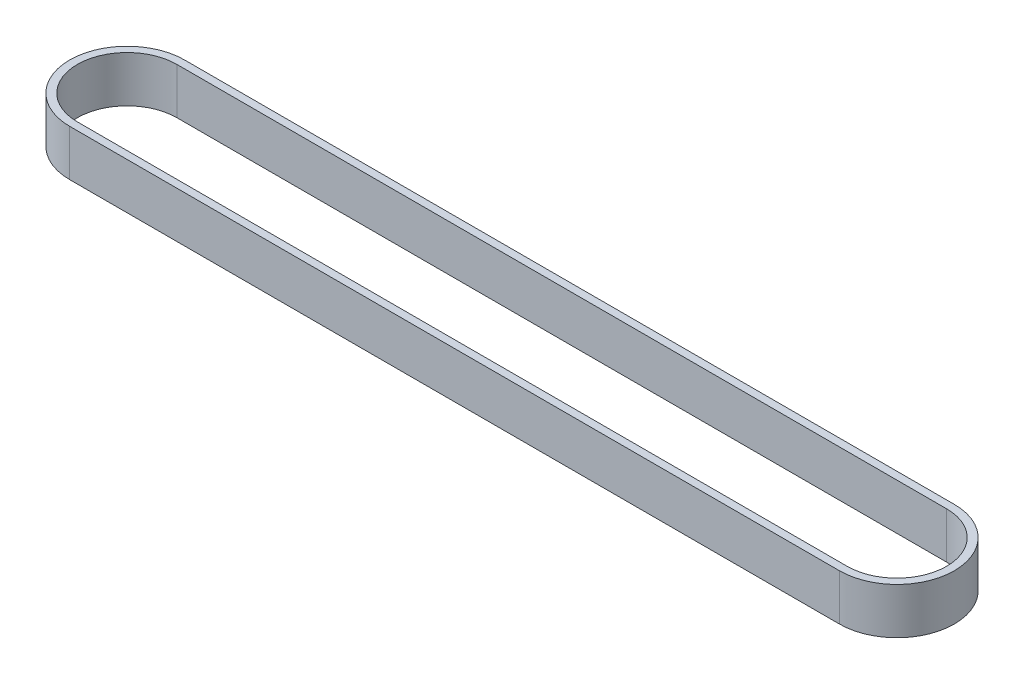
ISO-10303-21;
HEADER;
FILE_DESCRIPTION(('STEP AP214'),'2;1');
FILE_NAME('part.step','',(''),(''),'','','');
FILE_SCHEMA(('AUTOMOTIVE_DESIGN { 1 0 10303 214 1 1 1 1 }'));
ENDSEC;
DATA;
#1=APPLICATION_CONTEXT('core data for automotive mechanical design processes');
#2=APPLICATION_PROTOCOL_DEFINITION('international standard','automotive_design',2000,#1);
#3=PRODUCT_CONTEXT('',#1,'mechanical');
#4=PRODUCT('Part','Part','',(#3));
#5=PRODUCT_RELATED_PRODUCT_CATEGORY('part','',(#4));
#6=PRODUCT_DEFINITION_FORMATION('','',#4);
#7=PRODUCT_DEFINITION_CONTEXT('part definition',#1,'design');
#8=PRODUCT_DEFINITION('design','',#6,#7);
#9=PRODUCT_DEFINITION_SHAPE('','',#8);
#10=(LENGTH_UNIT() NAMED_UNIT(*) SI_UNIT(.MILLI.,.METRE.));
#11=(NAMED_UNIT(*) PLANE_ANGLE_UNIT() SI_UNIT($,.RADIAN.));
#12=(NAMED_UNIT(*) SI_UNIT($,.STERADIAN.) SOLID_ANGLE_UNIT());
#13=UNCERTAINTY_MEASURE_WITH_UNIT(LENGTH_MEASURE(1.E-05),#10,'distance_accuracy_value','');
#14=(GEOMETRIC_REPRESENTATION_CONTEXT(3) GLOBAL_UNCERTAINTY_ASSIGNED_CONTEXT((#13)) GLOBAL_UNIT_ASSIGNED_CONTEXT((#10,
#11,#12)) REPRESENTATION_CONTEXT('',''));
#15=CARTESIAN_POINT('',(0.,0.,0.));
#16=DIRECTION('',(0.,0.,1.));
#17=DIRECTION('',(1.,0.,0.));
#18=AXIS2_PLACEMENT_3D('',#15,#16,#17);
#19=CARTESIAN_POINT('',(-50.,6.,0.));
#20=DIRECTION('',(0.,1.,0.));
#21=DIRECTION('',(0.,0.,1.));
#22=AXIS2_PLACEMENT_3D('',#19,#20,#21);
#23=PLANE('',#22);
#24=CARTESIAN_POINT('',(-50.,6.,0.));
#25=DIRECTION('',(0.,1.,0.));
#26=DIRECTION('',(0.,0.,1.));
#27=AXIS2_PLACEMENT_3D('',#24,#25,#26);
#28=CIRCLE('',#27,7.465);
#29=CARTESIAN_POINT('',(-50.,6.,-7.465));
#30=VERTEX_POINT('',#29);
#31=CARTESIAN_POINT('',(-50.,6.,7.465));
#32=VERTEX_POINT('',#31);
#33=EDGE_CURVE('E134',#30,#32,#28,.T.);
#34=ORIENTED_EDGE('',*,*,#33,.T.);
#35=DIRECTION('',(1.,0.,0.));
#36=VECTOR('',#35,1.);
#37=CARTESIAN_POINT('',(-50.,6.,7.465));
#38=LINE('',#37,#36);
#39=CARTESIAN_POINT('',(50.,6.,7.465));
#40=VERTEX_POINT('',#39);
#41=EDGE_CURVE('E137',#32,#40,#38,.T.);
#42=ORIENTED_EDGE('',*,*,#41,.T.);
#43=CARTESIAN_POINT('',(50.,6.,0.));
#44=DIRECTION('',(0.,1.,0.));
#45=DIRECTION('',(0.,0.,1.));
#46=AXIS2_PLACEMENT_3D('',#43,#44,#45);
#47=CIRCLE('',#46,7.465);
#48=CARTESIAN_POINT('',(50.,6.,-7.465));
#49=VERTEX_POINT('',#48);
#50=EDGE_CURVE('E140',#40,#49,#47,.T.);
#51=ORIENTED_EDGE('',*,*,#50,.T.);
#52=DIRECTION('',(-1.,0.,0.));
#53=VECTOR('',#52,1.);
#54=CARTESIAN_POINT('',(-50.,6.,-7.465));
#55=LINE('',#54,#53);
#56=EDGE_CURVE('E142',#49,#30,#55,.T.);
#57=ORIENTED_EDGE('',*,*,#56,.T.);
#58=EDGE_LOOP('',(#34,#42,#51,#57));
#59=FACE_BOUND('',#58,.T.);
#60=DIRECTION('',(-1.,0.,0.));
#61=VECTOR('',#60,1.);
#62=CARTESIAN_POINT('',(-50.,6.,-6.465));
#63=LINE('',#62,#61);
#64=CARTESIAN_POINT('',(50.,6.,-6.465));
#65=VERTEX_POINT('',#64);
#66=CARTESIAN_POINT('',(-50.,6.,-6.465));
#67=VERTEX_POINT('',#66);
#68=EDGE_CURVE('E106',#65,#67,#63,.T.);
#69=ORIENTED_EDGE('',*,*,#68,.F.);
#70=CARTESIAN_POINT('',(50.,6.,0.));
#71=DIRECTION('',(0.,1.,0.));
#72=DIRECTION('',(0.,0.,1.));
#73=AXIS2_PLACEMENT_3D('',#70,#71,#72);
#74=CIRCLE('',#73,6.465);
#75=CARTESIAN_POINT('',(50.,6.,6.465));
#76=VERTEX_POINT('',#75);
#77=EDGE_CURVE('E98',#76,#65,#74,.T.);
#78=ORIENTED_EDGE('',*,*,#77,.F.);
#79=DIRECTION('',(1.,0.,0.));
#80=VECTOR('',#79,1.);
#81=CARTESIAN_POINT('',(-50.,6.,6.465));
#82=LINE('',#81,#80);
#83=CARTESIAN_POINT('',(-50.,6.,6.465));
#84=VERTEX_POINT('',#83);
#85=EDGE_CURVE('E120',#84,#76,#82,.T.);
#86=ORIENTED_EDGE('',*,*,#85,.F.);
#87=CARTESIAN_POINT('',(-50.,6.,0.));
#88=DIRECTION('',(0.,1.,0.));
#89=DIRECTION('',(0.,0.,1.));
#90=AXIS2_PLACEMENT_3D('',#87,#88,#89);
#91=CIRCLE('',#90,6.465);
#92=EDGE_CURVE('E118',#67,#84,#91,.T.);
#93=ORIENTED_EDGE('',*,*,#92,.F.);
#94=EDGE_LOOP('',(#69,#78,#86,#93));
#95=FACE_BOUND('',#94,.T.);
#96=ADVANCED_FACE('F33',(#59,#95),#23,.T.);
#97=CARTESIAN_POINT('',(-50.,0.,0.));
#98=DIRECTION('',(0.,1.,0.));
#99=DIRECTION('',(0.,0.,1.));
#100=AXIS2_PLACEMENT_3D('',#97,#98,#99);
#101=PLANE('',#100);
#102=CARTESIAN_POINT('',(-50.,0.,0.));
#103=DIRECTION('',(0.,1.,0.));
#104=DIRECTION('',(0.,0.,1.));
#105=AXIS2_PLACEMENT_3D('',#102,#103,#104);
#106=CIRCLE('',#105,7.465);
#107=CARTESIAN_POINT('',(-50.,0.,-7.465));
#108=VERTEX_POINT('',#107);
#109=CARTESIAN_POINT('',(-50.,0.,7.465));
#110=VERTEX_POINT('',#109);
#111=EDGE_CURVE('E114',#108,#110,#106,.T.);
#112=ORIENTED_EDGE('',*,*,#111,.F.);
#113=DIRECTION('',(-1.,0.,0.));
#114=VECTOR('',#113,1.);
#115=CARTESIAN_POINT('',(-50.,0.,-7.465));
#116=LINE('',#115,#114);
#117=CARTESIAN_POINT('',(50.,0.,-7.465));
#118=VERTEX_POINT('',#117);
#119=EDGE_CURVE('E138',#118,#108,#116,.T.);
#120=ORIENTED_EDGE('',*,*,#119,.F.);
#121=CARTESIAN_POINT('',(50.,0.,0.));
#122=DIRECTION('',(0.,1.,0.));
#123=DIRECTION('',(0.,0.,1.));
#124=AXIS2_PLACEMENT_3D('',#121,#122,#123);
#125=CIRCLE('',#124,7.465);
#126=CARTESIAN_POINT('',(50.,0.,7.465));
#127=VERTEX_POINT('',#126);
#128=EDGE_CURVE('E149',#127,#118,#125,.T.);
#129=ORIENTED_EDGE('',*,*,#128,.F.);
#130=DIRECTION('',(1.,0.,0.));
#131=VECTOR('',#130,1.);
#132=CARTESIAN_POINT('',(-50.,0.,7.465));
#133=LINE('',#132,#131);
#134=EDGE_CURVE('E147',#110,#127,#133,.T.);
#135=ORIENTED_EDGE('',*,*,#134,.F.);
#136=EDGE_LOOP('',(#112,#120,#129,#135));
#137=FACE_BOUND('',#136,.T.);
#138=CARTESIAN_POINT('',(50.,0.,0.));
#139=DIRECTION('',(0.,1.,0.));
#140=DIRECTION('',(0.,0.,1.));
#141=AXIS2_PLACEMENT_3D('',#138,#139,#140);
#142=CIRCLE('',#141,6.465);
#143=CARTESIAN_POINT('',(50.,0.,6.465));
#144=VERTEX_POINT('',#143);
#145=CARTESIAN_POINT('',(50.,0.,-6.465));
#146=VERTEX_POINT('',#145);
#147=EDGE_CURVE('E56',#144,#146,#142,.T.);
#148=ORIENTED_EDGE('',*,*,#147,.T.);
#149=DIRECTION('',(-1.,0.,0.));
#150=VECTOR('',#149,1.);
#151=CARTESIAN_POINT('',(-50.,0.,-6.465));
#152=LINE('',#151,#150);
#153=CARTESIAN_POINT('',(-50.,0.,-6.465));
#154=VERTEX_POINT('',#153);
#155=EDGE_CURVE('E113',#146,#154,#152,.T.);
#156=ORIENTED_EDGE('',*,*,#155,.T.);
#157=CARTESIAN_POINT('',(-50.,0.,0.));
#158=DIRECTION('',(0.,1.,0.));
#159=DIRECTION('',(0.,0.,1.));
#160=AXIS2_PLACEMENT_3D('',#157,#158,#159);
#161=CIRCLE('',#160,6.465);
#162=CARTESIAN_POINT('',(-50.,0.,6.465));
#163=VERTEX_POINT('',#162);
#164=EDGE_CURVE('E126',#154,#163,#161,.T.);
#165=ORIENTED_EDGE('',*,*,#164,.T.);
#166=DIRECTION('',(1.,0.,0.));
#167=VECTOR('',#166,1.);
#168=CARTESIAN_POINT('',(-50.,0.,6.465));
#169=LINE('',#168,#167);
#170=EDGE_CURVE('E107',#163,#144,#169,.T.);
#171=ORIENTED_EDGE('',*,*,#170,.T.);
#172=EDGE_LOOP('',(#148,#156,#165,#171));
#173=FACE_BOUND('',#172,.T.);
#174=ADVANCED_FACE('F167',(#137,#173),#101,.F.);
#175=CARTESIAN_POINT('',(-50.,6.,0.));
#176=DIRECTION('',(0.,-1.,0.));
#177=DIRECTION('',(0.,0.,-1.));
#178=AXIS2_PLACEMENT_3D('',#175,#176,#177);
#179=CYLINDRICAL_SURFACE('',#178,7.465);
#180=ORIENTED_EDGE('',*,*,#111,.T.);
#181=DIRECTION('',(0.,-1.,0.));
#182=VECTOR('',#181,1.);
#183=CARTESIAN_POINT('',(-50.,6.,7.465));
#184=LINE('',#183,#182);
#185=EDGE_CURVE('E11',#32,#110,#184,.T.);
#186=ORIENTED_EDGE('',*,*,#185,.F.);
#187=ORIENTED_EDGE('',*,*,#33,.F.);
#188=DIRECTION('',(0.,-1.,0.));
#189=VECTOR('',#188,1.);
#190=CARTESIAN_POINT('',(-50.,6.,-7.465));
#191=LINE('',#190,#189);
#192=EDGE_CURVE('E144',#30,#108,#191,.T.);
#193=ORIENTED_EDGE('',*,*,#192,.T.);
#194=EDGE_LOOP('',(#180,#186,#187,#193));
#195=FACE_BOUND('',#194,.T.);
#196=ADVANCED_FACE('F35',(#195),#179,.T.);
#197=CARTESIAN_POINT('',(-50.,6.,7.465));
#198=DIRECTION('',(0.,0.,-1.));
#199=DIRECTION('',(-1.,0.,0.));
#200=AXIS2_PLACEMENT_3D('',#197,#198,#199);
#201=PLANE('',#200);
#202=ORIENTED_EDGE('',*,*,#134,.T.);
#203=DIRECTION('',(0.,-1.,0.));
#204=VECTOR('',#203,1.);
#205=CARTESIAN_POINT('',(50.,6.,7.465));
#206=LINE('',#205,#204);
#207=EDGE_CURVE('E41',#40,#127,#206,.T.);
#208=ORIENTED_EDGE('',*,*,#207,.F.);
#209=ORIENTED_EDGE('',*,*,#41,.F.);
#210=ORIENTED_EDGE('',*,*,#185,.T.);
#211=EDGE_LOOP('',(#202,#208,#209,#210));
#212=FACE_BOUND('',#211,.T.);
#213=ADVANCED_FACE('F177',(#212),#201,.F.);
#214=CARTESIAN_POINT('',(50.,6.,0.));
#215=DIRECTION('',(0.,-1.,0.));
#216=DIRECTION('',(0.,0.,-1.));
#217=AXIS2_PLACEMENT_3D('',#214,#215,#216);
#218=CYLINDRICAL_SURFACE('',#217,7.465);
#219=ORIENTED_EDGE('',*,*,#128,.T.);
#220=DIRECTION('',(0.,-1.,0.));
#221=VECTOR('',#220,1.);
#222=CARTESIAN_POINT('',(50.,6.,-7.465));
#223=LINE('',#222,#221);
#224=EDGE_CURVE('E154',#49,#118,#223,.T.);
#225=ORIENTED_EDGE('',*,*,#224,.F.);
#226=ORIENTED_EDGE('',*,*,#50,.F.);
#227=ORIENTED_EDGE('',*,*,#207,.T.);
#228=EDGE_LOOP('',(#219,#225,#226,#227));
#229=FACE_BOUND('',#228,.T.);
#230=ADVANCED_FACE('F161',(#229),#218,.T.);
#231=CARTESIAN_POINT('',(-50.,6.,-7.465));
#232=DIRECTION('',(0.,0.,1.));
#233=DIRECTION('',(1.,0.,0.));
#234=AXIS2_PLACEMENT_3D('',#231,#232,#233);
#235=PLANE('',#234);
#236=ORIENTED_EDGE('',*,*,#119,.T.);
#237=ORIENTED_EDGE('',*,*,#192,.F.);
#238=ORIENTED_EDGE('',*,*,#56,.F.);
#239=ORIENTED_EDGE('',*,*,#224,.T.);
#240=EDGE_LOOP('',(#236,#237,#238,#239));
#241=FACE_BOUND('',#240,.T.);
#242=ADVANCED_FACE('F171',(#241),#235,.F.);
#243=CARTESIAN_POINT('',(50.,6.,0.));
#244=DIRECTION('',(0.,-1.,0.));
#245=DIRECTION('',(0.,0.,-1.));
#246=AXIS2_PLACEMENT_3D('',#243,#244,#245);
#247=CYLINDRICAL_SURFACE('',#246,6.465);
#248=ORIENTED_EDGE('',*,*,#147,.F.);
#249=DIRECTION('',(0.,-1.,0.));
#250=VECTOR('',#249,1.);
#251=CARTESIAN_POINT('',(50.,6.,6.465));
#252=LINE('',#251,#250);
#253=EDGE_CURVE('E102',#76,#144,#252,.T.);
#254=ORIENTED_EDGE('',*,*,#253,.F.);
#255=ORIENTED_EDGE('',*,*,#77,.T.);
#256=DIRECTION('',(0.,-1.,0.));
#257=VECTOR('',#256,1.);
#258=CARTESIAN_POINT('',(50.,6.,-6.465));
#259=LINE('',#258,#257);
#260=EDGE_CURVE('E101',#65,#146,#259,.T.);
#261=ORIENTED_EDGE('',*,*,#260,.T.);
#262=EDGE_LOOP('',(#248,#254,#255,#261));
#263=FACE_BOUND('',#262,.T.);
#264=ADVANCED_FACE('F100',(#263),#247,.F.);
#265=CARTESIAN_POINT('',(-50.,6.,-6.465));
#266=DIRECTION('',(0.,0.,1.));
#267=DIRECTION('',(1.,0.,0.));
#268=AXIS2_PLACEMENT_3D('',#265,#266,#267);
#269=PLANE('',#268);
#270=ORIENTED_EDGE('',*,*,#155,.F.);
#271=ORIENTED_EDGE('',*,*,#260,.F.);
#272=ORIENTED_EDGE('',*,*,#68,.T.);
#273=DIRECTION('',(0.,-1.,0.));
#274=VECTOR('',#273,1.);
#275=CARTESIAN_POINT('',(-50.,6.,-6.465));
#276=LINE('',#275,#274);
#277=EDGE_CURVE('E115',#67,#154,#276,.T.);
#278=ORIENTED_EDGE('',*,*,#277,.T.);
#279=EDGE_LOOP('',(#270,#271,#272,#278));
#280=FACE_BOUND('',#279,.T.);
#281=ADVANCED_FACE('F110',(#280),#269,.T.);
#282=CARTESIAN_POINT('',(-50.,6.,0.));
#283=DIRECTION('',(0.,-1.,0.));
#284=DIRECTION('',(0.,0.,-1.));
#285=AXIS2_PLACEMENT_3D('',#282,#283,#284);
#286=CYLINDRICAL_SURFACE('',#285,6.465);
#287=ORIENTED_EDGE('',*,*,#164,.F.);
#288=ORIENTED_EDGE('',*,*,#277,.F.);
#289=ORIENTED_EDGE('',*,*,#92,.T.);
#290=DIRECTION('',(0.,-1.,0.));
#291=VECTOR('',#290,1.);
#292=CARTESIAN_POINT('',(-50.,6.,6.465));
#293=LINE('',#292,#291);
#294=EDGE_CURVE('E48',#84,#163,#293,.T.);
#295=ORIENTED_EDGE('',*,*,#294,.T.);
#296=EDGE_LOOP('',(#287,#288,#289,#295));
#297=FACE_BOUND('',#296,.T.);
#298=ADVANCED_FACE('F200',(#297),#286,.F.);
#299=CARTESIAN_POINT('',(-50.,6.,6.465));
#300=DIRECTION('',(0.,0.,-1.));
#301=DIRECTION('',(-1.,0.,0.));
#302=AXIS2_PLACEMENT_3D('',#299,#300,#301);
#303=PLANE('',#302);
#304=ORIENTED_EDGE('',*,*,#170,.F.);
#305=ORIENTED_EDGE('',*,*,#294,.F.);
#306=ORIENTED_EDGE('',*,*,#85,.T.);
#307=ORIENTED_EDGE('',*,*,#253,.T.);
#308=EDGE_LOOP('',(#304,#305,#306,#307));
#309=FACE_BOUND('',#308,.T.);
#310=ADVANCED_FACE('F204',(#309),#303,.T.);
#311=CLOSED_SHELL('',(#96,#174,#196,#213,#230,#242,#264,#281,#298,#310));
#312=MANIFOLD_SOLID_BREP('B2',#311);
#313=ADVANCED_BREP_SHAPE_REPRESENTATION('',(#18,#312),#14);
#314=SHAPE_DEFINITION_REPRESENTATION(#9,#313);
ENDSEC;
END-ISO-10303-21;
